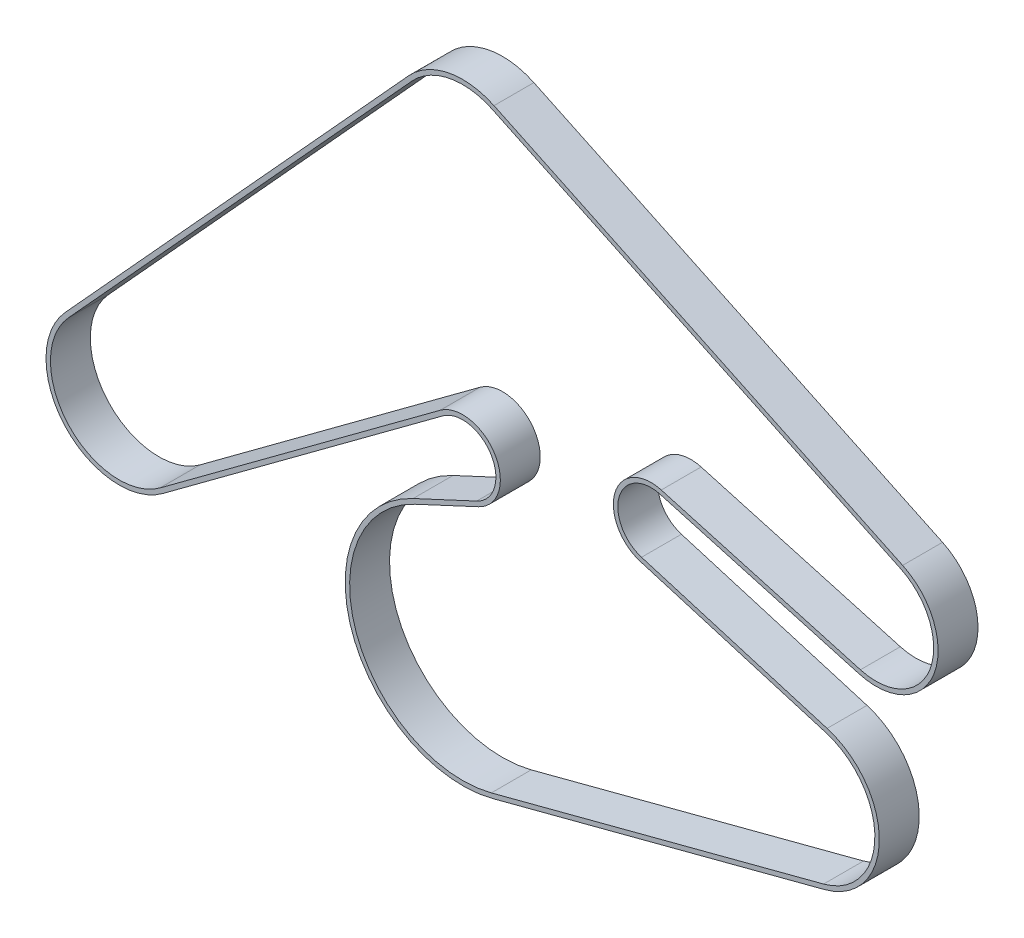
ISO-10303-21;
HEADER;
FILE_DESCRIPTION(('STEP AP214'),'2;1');
FILE_NAME('part.step','',(''),(''),'','','');
FILE_SCHEMA(('AUTOMOTIVE_DESIGN { 1 0 10303 214 1 1 1 1 }'));
ENDSEC;
DATA;
#1=APPLICATION_CONTEXT('core data for automotive mechanical design processes');
#2=APPLICATION_PROTOCOL_DEFINITION('international standard','automotive_design',2000,#1);
#3=PRODUCT_CONTEXT('',#1,'mechanical');
#4=PRODUCT('Part','Part','',(#3));
#5=PRODUCT_RELATED_PRODUCT_CATEGORY('part','',(#4));
#6=PRODUCT_DEFINITION_FORMATION('','',#4);
#7=PRODUCT_DEFINITION_CONTEXT('part definition',#1,'design');
#8=PRODUCT_DEFINITION('design','',#6,#7);
#9=PRODUCT_DEFINITION_SHAPE('','',#8);
#10=(LENGTH_UNIT() NAMED_UNIT(*) SI_UNIT(.MILLI.,.METRE.));
#11=(NAMED_UNIT(*) PLANE_ANGLE_UNIT() SI_UNIT($,.RADIAN.));
#12=(NAMED_UNIT(*) SI_UNIT($,.STERADIAN.) SOLID_ANGLE_UNIT());
#13=UNCERTAINTY_MEASURE_WITH_UNIT(LENGTH_MEASURE(1.E-05),#10,'distance_accuracy_value','');
#14=(GEOMETRIC_REPRESENTATION_CONTEXT(3) GLOBAL_UNCERTAINTY_ASSIGNED_CONTEXT((#13)) GLOBAL_UNIT_ASSIGNED_CONTEXT((#10,
#11,#12)) REPRESENTATION_CONTEXT('',''));
#15=CARTESIAN_POINT('',(0.,0.,0.));
#16=DIRECTION('',(0.,0.,1.));
#17=DIRECTION('',(1.,0.,0.));
#18=AXIS2_PLACEMENT_3D('',#15,#16,#17);
#19=CARTESIAN_POINT('',(85.,91.,18.));
#20=DIRECTION('',(0.,0.,-1.));
#21=DIRECTION('',(-1.,0.,0.));
#22=AXIS2_PLACEMENT_3D('',#19,#20,#21);
#23=PLANE('',#22);
#24=CARTESIAN_POINT('',(85.,91.,18.));
#25=DIRECTION('',(0.,0.,-1.));
#26=DIRECTION('',(1.,0.,0.));
#27=AXIS2_PLACEMENT_3D('',#24,#25,#26);
#28=CIRCLE('',#27,15.);
#29=CARTESIAN_POINT('',(80.707647493196,76.6272580918833,18.));
#30=VERTEX_POINT('',#29);
#31=CARTESIAN_POINT('',(89.0659579003717,105.438420493683,18.));
#32=VERTEX_POINT('',#31);
#33=EDGE_CURVE('E460',#30,#32,#28,.T.);
#34=ORIENTED_EDGE('',*,*,#33,.T.);
#35=DIRECTION('',(0.962561366245532,-0.271063860024781,0.));
#36=VECTOR('',#35,1.);
#37=CARTESIAN_POINT('',(89.0659579003717,105.438420493683,18.));
#38=LINE('',#37,#36);
#39=CARTESIAN_POINT('',(178.940955528026,80.1290068490307,18.));
#40=VERTEX_POINT('',#39);
#41=EDGE_CURVE('E464',#32,#40,#38,.T.);
#42=ORIENTED_EDGE('',*,*,#41,.T.);
#43=CARTESIAN_POINT('',(186.530743608719,107.080725103906,18.));
#44=DIRECTION('',(0.,0.,1.));
#45=DIRECTION('',(1.,0.,0.));
#46=AXIS2_PLACEMENT_3D('',#43,#44,#45);
#47=CIRCLE('',#46,28.);
#48=CARTESIAN_POINT('',(198.527826902004,132.380329694768,18.));
#49=VERTEX_POINT('',#48);
#50=EDGE_CURVE('E468',#40,#49,#47,.T.);
#51=ORIENTED_EDGE('',*,*,#50,.T.);
#52=DIRECTION('',(-0.903557306816511,0.428467260474466,0.));
#53=VECTOR('',#52,1.);
#54=CARTESIAN_POINT('',(14.1394195956574,219.817391124945,18.));
#55=LINE('',#54,#53);
#56=CARTESIAN_POINT('',(14.1394195956574,219.817391124945,18.));
#57=VERTEX_POINT('',#56);
#58=EDGE_CURVE('E471',#49,#57,#55,.T.);
#59=ORIENTED_EDGE('',*,*,#58,.T.);
#60=CARTESIAN_POINT('',(0.,190.,18.));
#61=DIRECTION('',(0.,0.,1.));
#62=DIRECTION('',(-1.,0.,0.));
#63=AXIS2_PLACEMENT_3D('',#60,#61,#62);
#64=CIRCLE('',#63,33.);
#65=CARTESIAN_POINT('',(-24.3855428491398,212.233877303628,18.));
#66=VERTEX_POINT('',#65);
#67=EDGE_CURVE('E474',#57,#66,#64,.T.);
#68=ORIENTED_EDGE('',*,*,#67,.T.);
#69=DIRECTION('',(-0.673753857685684,-0.738955843913328,0.));
#70=VECTOR('',#69,1.);
#71=CARTESIAN_POINT('',(-24.3855428491398,212.233877303628,18.));
#72=LINE('',#71,#70);
#73=CARTESIAN_POINT('',(-179.38554284914,42.2338773036282,18.));
#74=VERTEX_POINT('',#73);
#75=EDGE_CURVE('E477',#66,#74,#72,.T.);
#76=ORIENTED_EDGE('',*,*,#75,.T.);
#77=CARTESIAN_POINT('',(-155.,20.0000000000006,18.));
#78=DIRECTION('',(0.,0.,1.));
#79=DIRECTION('',(1.,0.,0.));
#80=AXIS2_PLACEMENT_3D('',#77,#78,#79);
#81=CIRCLE('',#80,33.);
#82=CARTESIAN_POINT('',(-135.368386906199,-6.5254550825292,18.));
#83=VERTEX_POINT('',#82);
#84=EDGE_CURVE('E480',#74,#83,#81,.T.);
#85=ORIENTED_EDGE('',*,*,#84,.T.);
#86=DIRECTION('',(0.803801669167571,0.594897366478813,0.));
#87=VECTOR('',#86,1.);
#88=CARTESIAN_POINT('',(-135.368386906199,-6.52545508252921,18.));
#89=LINE('',#88,#87);
#90=CARTESIAN_POINT('',(-8.9234604971822,87.0570250375136,18.));
#91=VERTEX_POINT('',#90);
#92=EDGE_CURVE('E483',#83,#91,#89,.T.);
#93=ORIENTED_EDGE('',*,*,#92,.T.);
#94=CARTESIAN_POINT('',(0.,75.,18.));
#95=DIRECTION('',(0.,0.,-1.));
#96=DIRECTION('',(-1.,0.,0.));
#97=AXIS2_PLACEMENT_3D('',#94,#95,#96);
#98=CIRCLE('',#97,15.);
#99=CARTESIAN_POINT('',(6.32771680782256,61.4,18.));
#100=VERTEX_POINT('',#99);
#101=EDGE_CURVE('E486',#91,#100,#98,.T.);
#102=ORIENTED_EDGE('',*,*,#101,.T.);
#103=DIRECTION('',(-0.906666666666666,-0.421847787188171,0.));
#104=VECTOR('',#103,1.);
#105=CARTESIAN_POINT('',(6.32771680782256,61.4,18.));
#106=LINE('',#105,#104);
#107=CARTESIAN_POINT('',(-22.3579327209731,48.0533333333333,18.));
#108=VERTEX_POINT('',#107);
#109=EDGE_CURVE('E489',#100,#108,#106,.T.);
#110=ORIENTED_EDGE('',*,*,#109,.T.);
#111=CARTESIAN_POINT('',(0.,0.,18.));
#112=DIRECTION('',(0.,0.,1.));
#113=DIRECTION('',(1.,0.,0.));
#114=AXIS2_PLACEMENT_3D('',#111,#112,#113);
#115=CIRCLE('',#114,53.);
#116=CARTESIAN_POINT('',(13.4534288638692,-51.2640736949846,18.));
#117=VERTEX_POINT('',#116);
#118=EDGE_CURVE('E492',#108,#117,#115,.T.);
#119=ORIENTED_EDGE('',*,*,#118,.T.);
#120=DIRECTION('',(0.967246673490275,0.253838280450362,0.));
#121=VECTOR('',#120,1.);
#122=CARTESIAN_POINT('',(13.4534288638692,-51.2640736949846,18.));
#123=LINE('',#122,#121);
#124=CARTESIAN_POINT('',(163.376663254862,-11.9191402251785,18.));
#125=VERTEX_POINT('',#124);
#126=EDGE_CURVE('E495',#117,#125,#123,.T.);
#127=ORIENTED_EDGE('',*,*,#126,.T.);
#128=CARTESIAN_POINT('',(155.,20.0000000000005,18.));
#129=DIRECTION('',(0.,0.,1.));
#130=DIRECTION('',(-1.,0.,0.));
#131=AXIS2_PLACEMENT_3D('',#128,#129,#130);
#132=CIRCLE('',#131,33.);
#133=CARTESIAN_POINT('',(164.443175514969,51.6200321978572,18.));
#134=VERTEX_POINT('',#133);
#135=EDGE_CURVE('E498',#125,#134,#132,.T.);
#136=ORIENTED_EDGE('',*,*,#135,.T.);
#137=DIRECTION('',(-0.958182793874446,0.286156833786931,0.));
#138=VECTOR('',#137,1.);
#139=CARTESIAN_POINT('',(164.443175514969,51.6200321978572,18.));
#140=LINE('',#139,#138);
#141=EDGE_CURVE('E501',#134,#30,#140,.T.);
#142=ORIENTED_EDGE('',*,*,#141,.T.);
#143=EDGE_LOOP('',(#34,#42,#51,#59,#68,#76,#85,#93,#102,#110,#119,#127,#136,#142));
#144=FACE_BOUND('',#143,.T.);
#145=CARTESIAN_POINT('',(85.,91.,18.));
#146=DIRECTION('',(0.,0.,1.));
#147=DIRECTION('',(1.,0.,0.));
#148=AXIS2_PLACEMENT_3D('',#145,#146,#147);
#149=CIRCLE('',#148,17.);
#150=CARTESIAN_POINT('',(80.1353338256222,74.7108925041344,18.));
#151=VERTEX_POINT('',#150);
#152=CARTESIAN_POINT('',(89.6080856204213,107.363543226174,18.));
#153=VERTEX_POINT('',#152);
#154=EDGE_CURVE('E311',#151,#153,#149,.F.);
#155=ORIENTED_EDGE('',*,*,#154,.F.);
#156=DIRECTION('',(-0.958182793874446,0.286156833786931,0.));
#157=VECTOR('',#156,1.);
#158=CARTESIAN_POINT('',(163.870861847395,49.7036666101083,18.));
#159=LINE('',#158,#157);
#160=CARTESIAN_POINT('',(163.870861847395,49.7036666101084,18.));
#161=VERTEX_POINT('',#160);
#162=EDGE_CURVE('E370',#161,#151,#159,.T.);
#163=ORIENTED_EDGE('',*,*,#162,.F.);
#164=CARTESIAN_POINT('',(155.,20.0000000000005,18.));
#165=DIRECTION('',(0.,0.,1.));
#166=DIRECTION('',(1.,0.,0.));
#167=AXIS2_PLACEMENT_3D('',#164,#165,#166);
#168=CIRCLE('',#167,31.);
#169=CARTESIAN_POINT('',(162.868986693961,-9.98464687819798,18.));
#170=VERTEX_POINT('',#169);
#171=EDGE_CURVE('E367',#170,#161,#168,.T.);
#172=ORIENTED_EDGE('',*,*,#171,.F.);
#173=DIRECTION('',(0.967246673490275,0.253838280450362,0.));
#174=VECTOR('',#173,1.);
#175=CARTESIAN_POINT('',(12.9457523029684,-49.3295803480041,18.));
#176=LINE('',#175,#174);
#177=CARTESIAN_POINT('',(12.9457523029685,-49.3295803480041,18.));
#178=VERTEX_POINT('',#177);
#179=EDGE_CURVE('E364',#178,#170,#176,.T.);
#180=ORIENTED_EDGE('',*,*,#179,.F.);
#181=CARTESIAN_POINT('',(0.,0.,18.));
#182=DIRECTION('',(0.,0.,1.));
#183=DIRECTION('',(1.,0.,0.));
#184=AXIS2_PLACEMENT_3D('',#181,#182,#183);
#185=CIRCLE('',#184,51.);
#186=CARTESIAN_POINT('',(-21.5142371465967,46.24,18.));
#187=VERTEX_POINT('',#186);
#188=EDGE_CURVE('E361',#187,#178,#185,.T.);
#189=ORIENTED_EDGE('',*,*,#188,.F.);
#190=DIRECTION('',(-0.906666666666666,-0.421847787188171,0.));
#191=VECTOR('',#190,1.);
#192=CARTESIAN_POINT('',(7.1714123821989,59.5866666666667,18.));
#193=LINE('',#192,#191);
#194=CARTESIAN_POINT('',(7.17141238219892,59.5866666666667,18.));
#195=VERTEX_POINT('',#194);
#196=EDGE_CURVE('E358',#195,#187,#193,.T.);
#197=ORIENTED_EDGE('',*,*,#196,.F.);
#198=CARTESIAN_POINT('',(0.,75.,18.));
#199=DIRECTION('',(0.,0.,1.));
#200=DIRECTION('',(1.,0.,0.));
#201=AXIS2_PLACEMENT_3D('',#198,#199,#200);
#202=CIRCLE('',#201,17.);
#203=CARTESIAN_POINT('',(-10.1132552301398,88.6646283758488,18.));
#204=VERTEX_POINT('',#203);
#205=EDGE_CURVE('E355',#204,#195,#202,.F.);
#206=ORIENTED_EDGE('',*,*,#205,.F.);
#207=DIRECTION('',(0.803801669167571,0.594897366478813,0.));
#208=VECTOR('',#207,1.);
#209=CARTESIAN_POINT('',(-136.558181639157,-4.91785174419407,18.));
#210=LINE('',#209,#208);
#211=CARTESIAN_POINT('',(-136.558181639157,-4.91785174419405,18.));
#212=VERTEX_POINT('',#211);
#213=EDGE_CURVE('E352',#212,#204,#210,.T.);
#214=ORIENTED_EDGE('',*,*,#213,.F.);
#215=CARTESIAN_POINT('',(-155.,20.0000000000006,18.));
#216=DIRECTION('',(0.,0.,1.));
#217=DIRECTION('',(1.,0.,0.));
#218=AXIS2_PLACEMENT_3D('',#215,#216,#217);
#219=CIRCLE('',#218,31.);
#220=CARTESIAN_POINT('',(-177.907631161313,40.8863695882568,18.));
#221=VERTEX_POINT('',#220);
#222=EDGE_CURVE('E349',#221,#212,#219,.T.);
#223=ORIENTED_EDGE('',*,*,#222,.F.);
#224=DIRECTION('',(-0.673753857685684,-0.738955843913328,0.));
#225=VECTOR('',#224,1.);
#226=CARTESIAN_POINT('',(-22.9076311613132,210.886369588256,18.));
#227=LINE('',#226,#225);
#228=CARTESIAN_POINT('',(-22.9076311613132,210.886369588256,18.));
#229=VERTEX_POINT('',#228);
#230=EDGE_CURVE('E346',#229,#221,#227,.T.);
#231=ORIENTED_EDGE('',*,*,#230,.F.);
#232=CARTESIAN_POINT('',(0.,190.,18.));
#233=DIRECTION('',(0.,0.,1.));
#234=DIRECTION('',(1.,0.,0.));
#235=AXIS2_PLACEMENT_3D('',#232,#233,#234);
#236=CIRCLE('',#235,31.);
#237=CARTESIAN_POINT('',(13.2824850747085,218.010276511312,18.));
#238=VERTEX_POINT('',#237);
#239=EDGE_CURVE('E343',#238,#229,#236,.T.);
#240=ORIENTED_EDGE('',*,*,#239,.F.);
#241=DIRECTION('',(-0.903557306816511,0.428467260474466,0.));
#242=VECTOR('',#241,1.);
#243=CARTESIAN_POINT('',(13.2824850747085,218.010276511312,18.));
#244=LINE('',#243,#242);
#245=CARTESIAN_POINT('',(197.670892381056,130.573215081135,18.));
#246=VERTEX_POINT('',#245);
#247=EDGE_CURVE('E338',#246,#238,#244,.T.);
#248=ORIENTED_EDGE('',*,*,#247,.F.);
#249=CARTESIAN_POINT('',(186.530743608719,107.080725103906,18.));
#250=DIRECTION('',(0.,0.,1.));
#251=DIRECTION('',(1.,0.,0.));
#252=AXIS2_PLACEMENT_3D('',#249,#250,#251);
#253=CIRCLE('',#252,26.);
#254=CARTESIAN_POINT('',(179.483083248075,82.0541295815217,18.));
#255=VERTEX_POINT('',#254);
#256=EDGE_CURVE('E334',#255,#246,#253,.T.);
#257=ORIENTED_EDGE('',*,*,#256,.F.);
#258=DIRECTION('',(0.962561366245532,-0.271063860024781,0.));
#259=VECTOR('',#258,1.);
#260=CARTESIAN_POINT('',(89.6080856204213,107.363543226174,18.));
#261=LINE('',#260,#259);
#262=EDGE_CURVE('E320',#153,#255,#261,.T.);
#263=ORIENTED_EDGE('',*,*,#262,.F.);
#264=EDGE_LOOP('',(#155,#163,#172,#180,#189,#197,#206,#214,#223,#231,#240,#248,#257,#263));
#265=FACE_BOUND('',#264,.T.);
#266=ADVANCED_FACE('F125',(#144,#265),#23,.F.);
#267=CARTESIAN_POINT('',(85.,91.,0.));
#268=DIRECTION('',(0.,0.,-1.));
#269=DIRECTION('',(-1.,0.,0.));
#270=AXIS2_PLACEMENT_3D('',#267,#268,#269);
#271=PLANE('',#270);
#272=CARTESIAN_POINT('',(85.,91.,0.));
#273=DIRECTION('',(0.,0.,-1.));
#274=DIRECTION('',(1.,0.,0.));
#275=AXIS2_PLACEMENT_3D('',#272,#273,#274);
#276=CIRCLE('',#275,15.);
#277=CARTESIAN_POINT('',(80.707647493196,76.6272580918833,0.));
#278=VERTEX_POINT('',#277);
#279=CARTESIAN_POINT('',(89.0659579003717,105.438420493683,0.));
#280=VERTEX_POINT('',#279);
#281=EDGE_CURVE('E329',#278,#280,#276,.T.);
#282=ORIENTED_EDGE('',*,*,#281,.F.);
#283=DIRECTION('',(-0.958182793874446,0.286156833786931,0.));
#284=VECTOR('',#283,1.);
#285=CARTESIAN_POINT('',(164.443175514969,51.6200321978572,0.));
#286=LINE('',#285,#284);
#287=CARTESIAN_POINT('',(164.443175514969,51.6200321978572,0.));
#288=VERTEX_POINT('',#287);
#289=EDGE_CURVE('E465',#288,#278,#286,.T.);
#290=ORIENTED_EDGE('',*,*,#289,.F.);
#291=CARTESIAN_POINT('',(155.,20.0000000000005,0.));
#292=DIRECTION('',(0.,0.,1.));
#293=DIRECTION('',(-1.,0.,0.));
#294=AXIS2_PLACEMENT_3D('',#291,#292,#293);
#295=CIRCLE('',#294,33.);
#296=CARTESIAN_POINT('',(163.376663254862,-11.9191402251785,0.));
#297=VERTEX_POINT('',#296);
#298=EDGE_CURVE('E541',#297,#288,#295,.T.);
#299=ORIENTED_EDGE('',*,*,#298,.F.);
#300=DIRECTION('',(0.967246673490275,0.253838280450362,0.));
#301=VECTOR('',#300,1.);
#302=CARTESIAN_POINT('',(13.4534288638692,-51.2640736949846,0.));
#303=LINE('',#302,#301);
#304=CARTESIAN_POINT('',(13.4534288638692,-51.2640736949846,0.));
#305=VERTEX_POINT('',#304);
#306=EDGE_CURVE('E538',#305,#297,#303,.T.);
#307=ORIENTED_EDGE('',*,*,#306,.F.);
#308=CARTESIAN_POINT('',(0.,0.,0.));
#309=DIRECTION('',(0.,0.,1.));
#310=DIRECTION('',(1.,0.,0.));
#311=AXIS2_PLACEMENT_3D('',#308,#309,#310);
#312=CIRCLE('',#311,53.);
#313=CARTESIAN_POINT('',(-22.3579327209731,48.0533333333333,0.));
#314=VERTEX_POINT('',#313);
#315=EDGE_CURVE('E535',#314,#305,#312,.T.);
#316=ORIENTED_EDGE('',*,*,#315,.F.);
#317=DIRECTION('',(-0.906666666666666,-0.421847787188171,0.));
#318=VECTOR('',#317,1.);
#319=CARTESIAN_POINT('',(6.32771680782256,61.4,0.));
#320=LINE('',#319,#318);
#321=CARTESIAN_POINT('',(6.32771680782256,61.4,0.));
#322=VERTEX_POINT('',#321);
#323=EDGE_CURVE('E532',#322,#314,#320,.T.);
#324=ORIENTED_EDGE('',*,*,#323,.F.);
#325=CARTESIAN_POINT('',(0.,75.,0.));
#326=DIRECTION('',(0.,0.,-1.));
#327=DIRECTION('',(-1.,0.,0.));
#328=AXIS2_PLACEMENT_3D('',#325,#326,#327);
#329=CIRCLE('',#328,15.);
#330=CARTESIAN_POINT('',(-8.9234604971822,87.0570250375136,0.));
#331=VERTEX_POINT('',#330);
#332=EDGE_CURVE('E529',#331,#322,#329,.T.);
#333=ORIENTED_EDGE('',*,*,#332,.F.);
#334=DIRECTION('',(0.803801669167571,0.594897366478813,0.));
#335=VECTOR('',#334,1.);
#336=CARTESIAN_POINT('',(-135.368386906199,-6.52545508252921,0.));
#337=LINE('',#336,#335);
#338=CARTESIAN_POINT('',(-135.368386906199,-6.5254550825292,0.));
#339=VERTEX_POINT('',#338);
#340=EDGE_CURVE('E526',#339,#331,#337,.T.);
#341=ORIENTED_EDGE('',*,*,#340,.F.);
#342=CARTESIAN_POINT('',(-155.,20.0000000000006,0.));
#343=DIRECTION('',(0.,0.,1.));
#344=DIRECTION('',(1.,0.,0.));
#345=AXIS2_PLACEMENT_3D('',#342,#343,#344);
#346=CIRCLE('',#345,33.);
#347=CARTESIAN_POINT('',(-179.38554284914,42.2338773036282,0.));
#348=VERTEX_POINT('',#347);
#349=EDGE_CURVE('E523',#348,#339,#346,.T.);
#350=ORIENTED_EDGE('',*,*,#349,.F.);
#351=DIRECTION('',(-0.673753857685684,-0.738955843913328,0.));
#352=VECTOR('',#351,1.);
#353=CARTESIAN_POINT('',(-24.3855428491398,212.233877303628,0.));
#354=LINE('',#353,#352);
#355=CARTESIAN_POINT('',(-24.3855428491398,212.233877303628,0.));
#356=VERTEX_POINT('',#355);
#357=EDGE_CURVE('E520',#356,#348,#354,.T.);
#358=ORIENTED_EDGE('',*,*,#357,.F.);
#359=CARTESIAN_POINT('',(0.,190.,0.));
#360=DIRECTION('',(0.,0.,1.));
#361=DIRECTION('',(-1.,0.,0.));
#362=AXIS2_PLACEMENT_3D('',#359,#360,#361);
#363=CIRCLE('',#362,33.);
#364=CARTESIAN_POINT('',(14.1394195956574,219.817391124945,0.));
#365=VERTEX_POINT('',#364);
#366=EDGE_CURVE('E517',#365,#356,#363,.T.);
#367=ORIENTED_EDGE('',*,*,#366,.F.);
#368=DIRECTION('',(-0.903557306816511,0.428467260474466,0.));
#369=VECTOR('',#368,1.);
#370=CARTESIAN_POINT('',(14.1394195956574,219.817391124945,0.));
#371=LINE('',#370,#369);
#372=CARTESIAN_POINT('',(198.527826902004,132.380329694768,0.));
#373=VERTEX_POINT('',#372);
#374=EDGE_CURVE('E514',#373,#365,#371,.T.);
#375=ORIENTED_EDGE('',*,*,#374,.F.);
#376=CARTESIAN_POINT('',(186.530743608719,107.080725103906,0.));
#377=DIRECTION('',(0.,0.,1.));
#378=DIRECTION('',(1.,0.,0.));
#379=AXIS2_PLACEMENT_3D('',#376,#377,#378);
#380=CIRCLE('',#379,28.);
#381=CARTESIAN_POINT('',(178.940955528026,80.1290068490307,0.));
#382=VERTEX_POINT('',#381);
#383=EDGE_CURVE('E511',#382,#373,#380,.T.);
#384=ORIENTED_EDGE('',*,*,#383,.F.);
#385=DIRECTION('',(0.962561366245532,-0.271063860024781,0.));
#386=VECTOR('',#385,1.);
#387=CARTESIAN_POINT('',(89.0659579003717,105.438420493683,0.));
#388=LINE('',#387,#386);
#389=EDGE_CURVE('E508',#280,#382,#388,.T.);
#390=ORIENTED_EDGE('',*,*,#389,.F.);
#391=EDGE_LOOP('',(#282,#290,#299,#307,#316,#324,#333,#341,#350,#358,#367,#375,#384,#390));
#392=FACE_BOUND('',#391,.T.);
#393=DIRECTION('',(-0.958182793874446,0.286156833786931,0.));
#394=VECTOR('',#393,1.);
#395=CARTESIAN_POINT('',(163.870861847395,49.7036666101083,0.));
#396=LINE('',#395,#394);
#397=CARTESIAN_POINT('',(163.870861847395,49.7036666101083,0.));
#398=VERTEX_POINT('',#397);
#399=CARTESIAN_POINT('',(80.1353338256222,74.7108925041345,0.));
#400=VERTEX_POINT('',#399);
#401=EDGE_CURVE('E321',#398,#400,#396,.T.);
#402=ORIENTED_EDGE('',*,*,#401,.T.);
#403=CARTESIAN_POINT('',(85.,91.,0.));
#404=DIRECTION('',(0.,0.,1.));
#405=DIRECTION('',(1.,0.,0.));
#406=AXIS2_PLACEMENT_3D('',#403,#404,#405);
#407=CIRCLE('',#406,17.);
#408=CARTESIAN_POINT('',(89.6080856204213,107.363543226174,0.));
#409=VERTEX_POINT('',#408);
#410=EDGE_CURVE('E149',#400,#409,#407,.F.);
#411=ORIENTED_EDGE('',*,*,#410,.T.);
#412=DIRECTION('',(0.962561366245532,-0.271063860024781,0.));
#413=VECTOR('',#412,1.);
#414=CARTESIAN_POINT('',(89.6080856204213,107.363543226174,0.));
#415=LINE('',#414,#413);
#416=CARTESIAN_POINT('',(179.483083248075,82.0541295815217,0.));
#417=VERTEX_POINT('',#416);
#418=EDGE_CURVE('E327',#409,#417,#415,.T.);
#419=ORIENTED_EDGE('',*,*,#418,.T.);
#420=CARTESIAN_POINT('',(186.530743608719,107.080725103906,0.));
#421=DIRECTION('',(0.,0.,1.));
#422=DIRECTION('',(1.,0.,0.));
#423=AXIS2_PLACEMENT_3D('',#420,#421,#422);
#424=CIRCLE('',#423,26.);
#425=CARTESIAN_POINT('',(197.670892381056,130.573215081135,0.));
#426=VERTEX_POINT('',#425);
#427=EDGE_CURVE('E377',#417,#426,#424,.T.);
#428=ORIENTED_EDGE('',*,*,#427,.T.);
#429=DIRECTION('',(-0.903557306816511,0.428467260474466,0.));
#430=VECTOR('',#429,1.);
#431=CARTESIAN_POINT('',(13.2824850747085,218.010276511312,0.));
#432=LINE('',#431,#430);
#433=CARTESIAN_POINT('',(13.2824850747085,218.010276511312,0.));
#434=VERTEX_POINT('',#433);
#435=EDGE_CURVE('E381',#426,#434,#432,.T.);
#436=ORIENTED_EDGE('',*,*,#435,.T.);
#437=CARTESIAN_POINT('',(0.,190.,0.));
#438=DIRECTION('',(0.,0.,1.));
#439=DIRECTION('',(1.,0.,0.));
#440=AXIS2_PLACEMENT_3D('',#437,#438,#439);
#441=CIRCLE('',#440,31.);
#442=CARTESIAN_POINT('',(-22.9076311613132,210.886369588256,0.));
#443=VERTEX_POINT('',#442);
#444=EDGE_CURVE('E385',#434,#443,#441,.T.);
#445=ORIENTED_EDGE('',*,*,#444,.T.);
#446=DIRECTION('',(-0.673753857685684,-0.738955843913328,0.));
#447=VECTOR('',#446,1.);
#448=CARTESIAN_POINT('',(-22.9076311613132,210.886369588256,0.));
#449=LINE('',#448,#447);
#450=CARTESIAN_POINT('',(-177.907631161313,40.8863695882568,0.));
#451=VERTEX_POINT('',#450);
#452=EDGE_CURVE('E389',#443,#451,#449,.T.);
#453=ORIENTED_EDGE('',*,*,#452,.T.);
#454=CARTESIAN_POINT('',(-155.,20.0000000000006,0.));
#455=DIRECTION('',(0.,0.,1.));
#456=DIRECTION('',(1.,0.,0.));
#457=AXIS2_PLACEMENT_3D('',#454,#455,#456);
#458=CIRCLE('',#457,31.);
#459=CARTESIAN_POINT('',(-136.558181639157,-4.91785174419405,0.));
#460=VERTEX_POINT('',#459);
#461=EDGE_CURVE('E393',#451,#460,#458,.T.);
#462=ORIENTED_EDGE('',*,*,#461,.T.);
#463=DIRECTION('',(0.803801669167571,0.594897366478813,0.));
#464=VECTOR('',#463,1.);
#465=CARTESIAN_POINT('',(-136.558181639157,-4.91785174419407,0.));
#466=LINE('',#465,#464);
#467=CARTESIAN_POINT('',(-10.1132552301398,88.6646283758488,0.));
#468=VERTEX_POINT('',#467);
#469=EDGE_CURVE('E397',#460,#468,#466,.T.);
#470=ORIENTED_EDGE('',*,*,#469,.T.);
#471=CARTESIAN_POINT('',(0.,75.,0.));
#472=DIRECTION('',(0.,0.,1.));
#473=DIRECTION('',(1.,0.,0.));
#474=AXIS2_PLACEMENT_3D('',#471,#472,#473);
#475=CIRCLE('',#474,17.);
#476=CARTESIAN_POINT('',(7.17141238219892,59.5866666666667,0.));
#477=VERTEX_POINT('',#476);
#478=EDGE_CURVE('E401',#468,#477,#475,.F.);
#479=ORIENTED_EDGE('',*,*,#478,.T.);
#480=DIRECTION('',(-0.906666666666666,-0.421847787188171,0.));
#481=VECTOR('',#480,1.);
#482=CARTESIAN_POINT('',(7.1714123821989,59.5866666666667,0.));
#483=LINE('',#482,#481);
#484=CARTESIAN_POINT('',(-21.5142371465967,46.24,0.));
#485=VERTEX_POINT('',#484);
#486=EDGE_CURVE('E405',#477,#485,#483,.T.);
#487=ORIENTED_EDGE('',*,*,#486,.T.);
#488=CARTESIAN_POINT('',(0.,0.,0.));
#489=DIRECTION('',(0.,0.,1.));
#490=DIRECTION('',(1.,0.,0.));
#491=AXIS2_PLACEMENT_3D('',#488,#489,#490);
#492=CIRCLE('',#491,51.);
#493=CARTESIAN_POINT('',(12.9457523029685,-49.3295803480041,0.));
#494=VERTEX_POINT('',#493);
#495=EDGE_CURVE('E409',#485,#494,#492,.T.);
#496=ORIENTED_EDGE('',*,*,#495,.T.);
#497=DIRECTION('',(0.967246673490275,0.253838280450362,0.));
#498=VECTOR('',#497,1.);
#499=CARTESIAN_POINT('',(12.9457523029684,-49.3295803480041,0.));
#500=LINE('',#499,#498);
#501=CARTESIAN_POINT('',(162.868986693961,-9.98464687819798,0.));
#502=VERTEX_POINT('',#501);
#503=EDGE_CURVE('E413',#494,#502,#500,.T.);
#504=ORIENTED_EDGE('',*,*,#503,.T.);
#505=CARTESIAN_POINT('',(155.,20.0000000000005,0.));
#506=DIRECTION('',(0.,0.,1.));
#507=DIRECTION('',(1.,0.,0.));
#508=AXIS2_PLACEMENT_3D('',#505,#506,#507);
#509=CIRCLE('',#508,31.);
#510=EDGE_CURVE('E417',#502,#398,#509,.T.);
#511=ORIENTED_EDGE('',*,*,#510,.T.);
#512=EDGE_LOOP('',(#402,#411,#419,#428,#436,#445,#453,#462,#470,#479,#487,#496,#504,#511));
#513=FACE_BOUND('',#512,.T.);
#514=ADVANCED_FACE('F604',(#392,#513),#271,.T.);
#515=CARTESIAN_POINT('',(85.,91.,18.));
#516=DIRECTION('',(0.,0.,-1.));
#517=DIRECTION('',(-1.,0.,0.));
#518=AXIS2_PLACEMENT_3D('',#515,#516,#517);
#519=CYLINDRICAL_SURFACE('',#518,15.);
#520=ORIENTED_EDGE('',*,*,#281,.T.);
#521=DIRECTION('',(0.,0.,-1.));
#522=VECTOR('',#521,1.);
#523=CARTESIAN_POINT('',(89.0659579003717,105.438420493683,18.));
#524=LINE('',#523,#522);
#525=EDGE_CURVE('E12',#32,#280,#524,.T.);
#526=ORIENTED_EDGE('',*,*,#525,.F.);
#527=ORIENTED_EDGE('',*,*,#33,.F.);
#528=DIRECTION('',(0.,0.,-1.));
#529=VECTOR('',#528,1.);
#530=CARTESIAN_POINT('',(80.707647493196,76.6272580918833,18.));
#531=LINE('',#530,#529);
#532=EDGE_CURVE('E504',#30,#278,#531,.T.);
#533=ORIENTED_EDGE('',*,*,#532,.T.);
#534=EDGE_LOOP('',(#520,#526,#527,#533));
#535=FACE_BOUND('',#534,.T.);
#536=ADVANCED_FACE('F127',(#535),#519,.F.);
#537=CARTESIAN_POINT('',(89.0659579003717,105.438420493683,18.));
#538=DIRECTION('',(0.271063860024781,0.962561366245532,0.));
#539=DIRECTION('',(-0.962561366245532,0.271063860024781,0.));
#540=AXIS2_PLACEMENT_3D('',#537,#538,#539);
#541=PLANE('',#540);
#542=ORIENTED_EDGE('',*,*,#389,.T.);
#543=DIRECTION('',(0.,0.,-1.));
#544=VECTOR('',#543,1.);
#545=CARTESIAN_POINT('',(178.940955528026,80.1290068490307,18.));
#546=LINE('',#545,#544);
#547=EDGE_CURVE('E134',#40,#382,#546,.T.);
#548=ORIENTED_EDGE('',*,*,#547,.F.);
#549=ORIENTED_EDGE('',*,*,#41,.F.);
#550=ORIENTED_EDGE('',*,*,#525,.T.);
#551=EDGE_LOOP('',(#542,#548,#549,#550));
#552=FACE_BOUND('',#551,.T.);
#553=ADVANCED_FACE('F621',(#552),#541,.F.);
#554=CARTESIAN_POINT('',(186.530743608719,107.080725103906,18.));
#555=DIRECTION('',(0.,0.,-1.));
#556=DIRECTION('',(-1.,0.,0.));
#557=AXIS2_PLACEMENT_3D('',#554,#555,#556);
#558=CYLINDRICAL_SURFACE('',#557,28.);
#559=ORIENTED_EDGE('',*,*,#383,.T.);
#560=DIRECTION('',(0.,0.,-1.));
#561=VECTOR('',#560,1.);
#562=CARTESIAN_POINT('',(198.527826902004,132.380329694768,18.));
#563=LINE('',#562,#561);
#564=EDGE_CURVE('E589',#49,#373,#563,.T.);
#565=ORIENTED_EDGE('',*,*,#564,.F.);
#566=ORIENTED_EDGE('',*,*,#50,.F.);
#567=ORIENTED_EDGE('',*,*,#547,.T.);
#568=EDGE_LOOP('',(#559,#565,#566,#567));
#569=FACE_BOUND('',#568,.T.);
#570=ADVANCED_FACE('F598',(#569),#558,.T.);
#571=CARTESIAN_POINT('',(14.1394195956574,219.817391124945,18.));
#572=DIRECTION('',(-0.428467260474466,-0.903557306816511,0.));
#573=DIRECTION('',(0.903557306816511,-0.428467260474466,0.));
#574=AXIS2_PLACEMENT_3D('',#571,#572,#573);
#575=PLANE('',#574);
#576=ORIENTED_EDGE('',*,*,#374,.T.);
#577=DIRECTION('',(0.,0.,-1.));
#578=VECTOR('',#577,1.);
#579=CARTESIAN_POINT('',(14.1394195956574,219.817391124945,18.));
#580=LINE('',#579,#578);
#581=EDGE_CURVE('E585',#57,#365,#580,.T.);
#582=ORIENTED_EDGE('',*,*,#581,.F.);
#583=ORIENTED_EDGE('',*,*,#58,.F.);
#584=ORIENTED_EDGE('',*,*,#564,.T.);
#585=EDGE_LOOP('',(#576,#582,#583,#584));
#586=FACE_BOUND('',#585,.T.);
#587=ADVANCED_FACE('F610',(#586),#575,.F.);
#588=CARTESIAN_POINT('',(0.,190.,18.));
#589=DIRECTION('',(0.,0.,-1.));
#590=DIRECTION('',(-1.,0.,0.));
#591=AXIS2_PLACEMENT_3D('',#588,#589,#590);
#592=CYLINDRICAL_SURFACE('',#591,33.);
#593=ORIENTED_EDGE('',*,*,#366,.T.);
#594=DIRECTION('',(0.,0.,-1.));
#595=VECTOR('',#594,1.);
#596=CARTESIAN_POINT('',(-24.3855428491398,212.233877303628,18.));
#597=LINE('',#596,#595);
#598=EDGE_CURVE('E581',#66,#356,#597,.T.);
#599=ORIENTED_EDGE('',*,*,#598,.F.);
#600=ORIENTED_EDGE('',*,*,#67,.F.);
#601=ORIENTED_EDGE('',*,*,#581,.T.);
#602=EDGE_LOOP('',(#593,#599,#600,#601));
#603=FACE_BOUND('',#602,.T.);
#604=ADVANCED_FACE('F614',(#603),#592,.T.);
#605=CARTESIAN_POINT('',(-24.3855428491398,212.233877303628,18.));
#606=DIRECTION('',(0.738955843913328,-0.673753857685684,0.));
#607=DIRECTION('',(0.673753857685684,0.738955843913328,0.));
#608=AXIS2_PLACEMENT_3D('',#605,#606,#607);
#609=PLANE('',#608);
#610=ORIENTED_EDGE('',*,*,#357,.T.);
#611=DIRECTION('',(0.,0.,-1.));
#612=VECTOR('',#611,1.);
#613=CARTESIAN_POINT('',(-179.38554284914,42.2338773036282,18.));
#614=LINE('',#613,#612);
#615=EDGE_CURVE('E577',#74,#348,#614,.T.);
#616=ORIENTED_EDGE('',*,*,#615,.F.);
#617=ORIENTED_EDGE('',*,*,#75,.F.);
#618=ORIENTED_EDGE('',*,*,#598,.T.);
#619=EDGE_LOOP('',(#610,#616,#617,#618));
#620=FACE_BOUND('',#619,.T.);
#621=ADVANCED_FACE('F664',(#620),#609,.F.);
#622=CARTESIAN_POINT('',(-155.,20.0000000000006,18.));
#623=DIRECTION('',(0.,0.,-1.));
#624=DIRECTION('',(-1.,0.,0.));
#625=AXIS2_PLACEMENT_3D('',#622,#623,#624);
#626=CYLINDRICAL_SURFACE('',#625,33.);
#627=ORIENTED_EDGE('',*,*,#349,.T.);
#628=DIRECTION('',(0.,0.,-1.));
#629=VECTOR('',#628,1.);
#630=CARTESIAN_POINT('',(-135.368386906199,-6.5254550825292,18.));
#631=LINE('',#630,#629);
#632=EDGE_CURVE('E573',#83,#339,#631,.T.);
#633=ORIENTED_EDGE('',*,*,#632,.F.);
#634=ORIENTED_EDGE('',*,*,#84,.F.);
#635=ORIENTED_EDGE('',*,*,#615,.T.);
#636=EDGE_LOOP('',(#627,#633,#634,#635));
#637=FACE_BOUND('',#636,.T.);
#638=ADVANCED_FACE('F662',(#637),#626,.T.);
#639=CARTESIAN_POINT('',(-135.368386906199,-6.52545508252921,18.));
#640=DIRECTION('',(-0.594897366478813,0.803801669167571,0.));
#641=DIRECTION('',(-0.803801669167571,-0.594897366478813,0.));
#642=AXIS2_PLACEMENT_3D('',#639,#640,#641);
#643=PLANE('',#642);
#644=ORIENTED_EDGE('',*,*,#340,.T.);
#645=DIRECTION('',(0.,0.,-1.));
#646=VECTOR('',#645,1.);
#647=CARTESIAN_POINT('',(-8.9234604971822,87.0570250375136,18.));
#648=LINE('',#647,#646);
#649=EDGE_CURVE('E569',#91,#331,#648,.T.);
#650=ORIENTED_EDGE('',*,*,#649,.F.);
#651=ORIENTED_EDGE('',*,*,#92,.F.);
#652=ORIENTED_EDGE('',*,*,#632,.T.);
#653=EDGE_LOOP('',(#644,#650,#651,#652));
#654=FACE_BOUND('',#653,.T.);
#655=ADVANCED_FACE('F657',(#654),#643,.F.);
#656=CARTESIAN_POINT('',(0.,75.,18.));
#657=DIRECTION('',(0.,0.,-1.));
#658=DIRECTION('',(-1.,0.,0.));
#659=AXIS2_PLACEMENT_3D('',#656,#657,#658);
#660=CYLINDRICAL_SURFACE('',#659,15.);
#661=ORIENTED_EDGE('',*,*,#332,.T.);
#662=DIRECTION('',(0.,0.,-1.));
#663=VECTOR('',#662,1.);
#664=CARTESIAN_POINT('',(6.32771680782256,61.4,18.));
#665=LINE('',#664,#663);
#666=EDGE_CURVE('E565',#100,#322,#665,.T.);
#667=ORIENTED_EDGE('',*,*,#666,.F.);
#668=ORIENTED_EDGE('',*,*,#101,.F.);
#669=ORIENTED_EDGE('',*,*,#649,.T.);
#670=EDGE_LOOP('',(#661,#667,#668,#669));
#671=FACE_BOUND('',#670,.T.);
#672=ADVANCED_FACE('F652',(#671),#660,.F.);
#673=CARTESIAN_POINT('',(6.32771680782256,61.4,18.));
#674=DIRECTION('',(0.421847787188171,-0.906666666666666,0.));
#675=DIRECTION('',(0.906666666666666,0.421847787188171,0.));
#676=AXIS2_PLACEMENT_3D('',#673,#674,#675);
#677=PLANE('',#676);
#678=ORIENTED_EDGE('',*,*,#323,.T.);
#679=DIRECTION('',(0.,0.,-1.));
#680=VECTOR('',#679,1.);
#681=CARTESIAN_POINT('',(-22.3579327209731,48.0533333333333,18.));
#682=LINE('',#681,#680);
#683=EDGE_CURVE('E561',#108,#314,#682,.T.);
#684=ORIENTED_EDGE('',*,*,#683,.F.);
#685=ORIENTED_EDGE('',*,*,#109,.F.);
#686=ORIENTED_EDGE('',*,*,#666,.T.);
#687=EDGE_LOOP('',(#678,#684,#685,#686));
#688=FACE_BOUND('',#687,.T.);
#689=ADVANCED_FACE('F648',(#688),#677,.F.);
#690=CARTESIAN_POINT('',(0.,0.,18.));
#691=DIRECTION('',(0.,0.,-1.));
#692=DIRECTION('',(-1.,0.,0.));
#693=AXIS2_PLACEMENT_3D('',#690,#691,#692);
#694=CYLINDRICAL_SURFACE('',#693,53.);
#695=ORIENTED_EDGE('',*,*,#315,.T.);
#696=DIRECTION('',(0.,0.,-1.));
#697=VECTOR('',#696,1.);
#698=CARTESIAN_POINT('',(13.4534288638692,-51.2640736949846,18.));
#699=LINE('',#698,#697);
#700=EDGE_CURVE('E557',#117,#305,#699,.T.);
#701=ORIENTED_EDGE('',*,*,#700,.F.);
#702=ORIENTED_EDGE('',*,*,#118,.F.);
#703=ORIENTED_EDGE('',*,*,#683,.T.);
#704=EDGE_LOOP('',(#695,#701,#702,#703));
#705=FACE_BOUND('',#704,.T.);
#706=ADVANCED_FACE('F643',(#705),#694,.T.);
#707=CARTESIAN_POINT('',(13.4534288638692,-51.2640736949846,18.));
#708=DIRECTION('',(-0.253838280450362,0.967246673490275,0.));
#709=DIRECTION('',(-0.967246673490275,-0.253838280450362,0.));
#710=AXIS2_PLACEMENT_3D('',#707,#708,#709);
#711=PLANE('',#710);
#712=ORIENTED_EDGE('',*,*,#306,.T.);
#713=DIRECTION('',(0.,0.,-1.));
#714=VECTOR('',#713,1.);
#715=CARTESIAN_POINT('',(163.376663254862,-11.9191402251785,18.));
#716=LINE('',#715,#714);
#717=EDGE_CURVE('E553',#125,#297,#716,.T.);
#718=ORIENTED_EDGE('',*,*,#717,.F.);
#719=ORIENTED_EDGE('',*,*,#126,.F.);
#720=ORIENTED_EDGE('',*,*,#700,.T.);
#721=EDGE_LOOP('',(#712,#718,#719,#720));
#722=FACE_BOUND('',#721,.T.);
#723=ADVANCED_FACE('F637',(#722),#711,.F.);
#724=CARTESIAN_POINT('',(155.,20.0000000000005,18.));
#725=DIRECTION('',(0.,0.,-1.));
#726=DIRECTION('',(-1.,0.,0.));
#727=AXIS2_PLACEMENT_3D('',#724,#725,#726);
#728=CYLINDRICAL_SURFACE('',#727,33.);
#729=ORIENTED_EDGE('',*,*,#298,.T.);
#730=DIRECTION('',(0.,0.,-1.));
#731=VECTOR('',#730,1.);
#732=CARTESIAN_POINT('',(164.443175514969,51.6200321978572,18.));
#733=LINE('',#732,#731);
#734=EDGE_CURVE('E549',#134,#288,#733,.T.);
#735=ORIENTED_EDGE('',*,*,#734,.F.);
#736=ORIENTED_EDGE('',*,*,#135,.F.);
#737=ORIENTED_EDGE('',*,*,#717,.T.);
#738=EDGE_LOOP('',(#729,#735,#736,#737));
#739=FACE_BOUND('',#738,.T.);
#740=ADVANCED_FACE('F633',(#739),#728,.T.);
#741=CARTESIAN_POINT('',(164.443175514969,51.6200321978572,18.));
#742=DIRECTION('',(-0.286156833786931,-0.958182793874446,0.));
#743=DIRECTION('',(0.958182793874446,-0.286156833786931,0.));
#744=AXIS2_PLACEMENT_3D('',#741,#742,#743);
#745=PLANE('',#744);
#746=ORIENTED_EDGE('',*,*,#289,.T.);
#747=ORIENTED_EDGE('',*,*,#532,.F.);
#748=ORIENTED_EDGE('',*,*,#141,.F.);
#749=ORIENTED_EDGE('',*,*,#734,.T.);
#750=EDGE_LOOP('',(#746,#747,#748,#749));
#751=FACE_BOUND('',#750,.T.);
#752=ADVANCED_FACE('F628',(#751),#745,.F.);
#753=CARTESIAN_POINT('',(85.,91.,18.));
#754=DIRECTION('',(0.,0.,-1.));
#755=DIRECTION('',(-1.,0.,0.));
#756=AXIS2_PLACEMENT_3D('',#753,#754,#755);
#757=CYLINDRICAL_SURFACE('',#756,17.);
#758=ORIENTED_EDGE('',*,*,#410,.F.);
#759=DIRECTION('',(0.,0.,-1.));
#760=VECTOR('',#759,1.);
#761=CARTESIAN_POINT('',(80.1353338256222,74.7108925041344,18.));
#762=LINE('',#761,#760);
#763=EDGE_CURVE('E315',#151,#400,#762,.T.);
#764=ORIENTED_EDGE('',*,*,#763,.F.);
#765=ORIENTED_EDGE('',*,*,#154,.T.);
#766=DIRECTION('',(0.,0.,-1.));
#767=VECTOR('',#766,1.);
#768=CARTESIAN_POINT('',(89.6080856204213,107.363543226174,18.));
#769=LINE('',#768,#767);
#770=EDGE_CURVE('E314',#153,#409,#769,.T.);
#771=ORIENTED_EDGE('',*,*,#770,.T.);
#772=EDGE_LOOP('',(#758,#764,#765,#771));
#773=FACE_BOUND('',#772,.T.);
#774=ADVANCED_FACE('F313',(#773),#757,.T.);
#775=CARTESIAN_POINT('',(89.6080856204213,107.363543226174,18.));
#776=DIRECTION('',(0.271063860024781,0.962561366245532,0.));
#777=DIRECTION('',(-0.962561366245532,0.271063860024781,0.));
#778=AXIS2_PLACEMENT_3D('',#775,#776,#777);
#779=PLANE('',#778);
#780=ORIENTED_EDGE('',*,*,#418,.F.);
#781=ORIENTED_EDGE('',*,*,#770,.F.);
#782=ORIENTED_EDGE('',*,*,#262,.T.);
#783=DIRECTION('',(0.,0.,-1.));
#784=VECTOR('',#783,1.);
#785=CARTESIAN_POINT('',(179.483083248075,82.0541295815217,18.));
#786=LINE('',#785,#784);
#787=EDGE_CURVE('E330',#255,#417,#786,.T.);
#788=ORIENTED_EDGE('',*,*,#787,.T.);
#789=EDGE_LOOP('',(#780,#781,#782,#788));
#790=FACE_BOUND('',#789,.T.);
#791=ADVANCED_FACE('F324',(#790),#779,.T.);
#792=CARTESIAN_POINT('',(186.530743608719,107.080725103906,18.));
#793=DIRECTION('',(0.,0.,-1.));
#794=DIRECTION('',(-1.,0.,0.));
#795=AXIS2_PLACEMENT_3D('',#792,#793,#794);
#796=CYLINDRICAL_SURFACE('',#795,26.);
#797=ORIENTED_EDGE('',*,*,#427,.F.);
#798=ORIENTED_EDGE('',*,*,#787,.F.);
#799=ORIENTED_EDGE('',*,*,#256,.T.);
#800=DIRECTION('',(0.,0.,-1.));
#801=VECTOR('',#800,1.);
#802=CARTESIAN_POINT('',(197.670892381056,130.573215081135,18.));
#803=LINE('',#802,#801);
#804=EDGE_CURVE('E455',#246,#426,#803,.T.);
#805=ORIENTED_EDGE('',*,*,#804,.T.);
#806=EDGE_LOOP('',(#797,#798,#799,#805));
#807=FACE_BOUND('',#806,.T.);
#808=ADVANCED_FACE('F734',(#807),#796,.F.);
#809=CARTESIAN_POINT('',(13.2824850747085,218.010276511312,18.));
#810=DIRECTION('',(-0.428467260474466,-0.903557306816511,0.));
#811=DIRECTION('',(0.903557306816511,-0.428467260474466,0.));
#812=AXIS2_PLACEMENT_3D('',#809,#810,#811);
#813=PLANE('',#812);
#814=ORIENTED_EDGE('',*,*,#435,.F.);
#815=ORIENTED_EDGE('',*,*,#804,.F.);
#816=ORIENTED_EDGE('',*,*,#247,.T.);
#817=DIRECTION('',(0.,0.,-1.));
#818=VECTOR('',#817,1.);
#819=CARTESIAN_POINT('',(13.2824850747085,218.010276511312,18.));
#820=LINE('',#819,#818);
#821=EDGE_CURVE('E452',#238,#434,#820,.T.);
#822=ORIENTED_EDGE('',*,*,#821,.T.);
#823=EDGE_LOOP('',(#814,#815,#816,#822));
#824=FACE_BOUND('',#823,.T.);
#825=ADVANCED_FACE('F740',(#824),#813,.T.);
#826=CARTESIAN_POINT('',(0.,190.,18.));
#827=DIRECTION('',(0.,0.,-1.));
#828=DIRECTION('',(-1.,0.,0.));
#829=AXIS2_PLACEMENT_3D('',#826,#827,#828);
#830=CYLINDRICAL_SURFACE('',#829,31.);
#831=ORIENTED_EDGE('',*,*,#444,.F.);
#832=ORIENTED_EDGE('',*,*,#821,.F.);
#833=ORIENTED_EDGE('',*,*,#239,.T.);
#834=DIRECTION('',(0.,0.,-1.));
#835=VECTOR('',#834,1.);
#836=CARTESIAN_POINT('',(-22.9076311613132,210.886369588256,18.));
#837=LINE('',#836,#835);
#838=EDGE_CURVE('E449',#229,#443,#837,.T.);
#839=ORIENTED_EDGE('',*,*,#838,.T.);
#840=EDGE_LOOP('',(#831,#832,#833,#839));
#841=FACE_BOUND('',#840,.T.);
#842=ADVANCED_FACE('F748',(#841),#830,.F.);
#843=CARTESIAN_POINT('',(-22.9076311613132,210.886369588256,18.));
#844=DIRECTION('',(0.738955843913328,-0.673753857685684,0.));
#845=DIRECTION('',(0.673753857685684,0.738955843913328,0.));
#846=AXIS2_PLACEMENT_3D('',#843,#844,#845);
#847=PLANE('',#846);
#848=ORIENTED_EDGE('',*,*,#452,.F.);
#849=ORIENTED_EDGE('',*,*,#838,.F.);
#850=ORIENTED_EDGE('',*,*,#230,.T.);
#851=DIRECTION('',(0.,0.,-1.));
#852=VECTOR('',#851,1.);
#853=CARTESIAN_POINT('',(-177.907631161313,40.8863695882568,18.));
#854=LINE('',#853,#852);
#855=EDGE_CURVE('E446',#221,#451,#854,.T.);
#856=ORIENTED_EDGE('',*,*,#855,.T.);
#857=EDGE_LOOP('',(#848,#849,#850,#856));
#858=FACE_BOUND('',#857,.T.);
#859=ADVANCED_FACE('F756',(#858),#847,.T.);
#860=CARTESIAN_POINT('',(-155.,20.0000000000006,18.));
#861=DIRECTION('',(0.,0.,-1.));
#862=DIRECTION('',(-1.,0.,0.));
#863=AXIS2_PLACEMENT_3D('',#860,#861,#862);
#864=CYLINDRICAL_SURFACE('',#863,31.);
#865=ORIENTED_EDGE('',*,*,#461,.F.);
#866=ORIENTED_EDGE('',*,*,#855,.F.);
#867=ORIENTED_EDGE('',*,*,#222,.T.);
#868=DIRECTION('',(0.,0.,-1.));
#869=VECTOR('',#868,1.);
#870=CARTESIAN_POINT('',(-136.558181639157,-4.91785174419405,18.));
#871=LINE('',#870,#869);
#872=EDGE_CURVE('E443',#212,#460,#871,.T.);
#873=ORIENTED_EDGE('',*,*,#872,.T.);
#874=EDGE_LOOP('',(#865,#866,#867,#873));
#875=FACE_BOUND('',#874,.T.);
#876=ADVANCED_FACE('F764',(#875),#864,.F.);
#877=CARTESIAN_POINT('',(-136.558181639157,-4.91785174419407,18.));
#878=DIRECTION('',(-0.594897366478813,0.803801669167571,0.));
#879=DIRECTION('',(-0.803801669167571,-0.594897366478813,0.));
#880=AXIS2_PLACEMENT_3D('',#877,#878,#879);
#881=PLANE('',#880);
#882=ORIENTED_EDGE('',*,*,#469,.F.);
#883=ORIENTED_EDGE('',*,*,#872,.F.);
#884=ORIENTED_EDGE('',*,*,#213,.T.);
#885=DIRECTION('',(0.,0.,-1.));
#886=VECTOR('',#885,1.);
#887=CARTESIAN_POINT('',(-10.1132552301398,88.6646283758488,18.));
#888=LINE('',#887,#886);
#889=EDGE_CURVE('E440',#204,#468,#888,.T.);
#890=ORIENTED_EDGE('',*,*,#889,.T.);
#891=EDGE_LOOP('',(#882,#883,#884,#890));
#892=FACE_BOUND('',#891,.T.);
#893=ADVANCED_FACE('F772',(#892),#881,.T.);
#894=CARTESIAN_POINT('',(0.,75.,18.));
#895=DIRECTION('',(0.,0.,-1.));
#896=DIRECTION('',(-1.,0.,0.));
#897=AXIS2_PLACEMENT_3D('',#894,#895,#896);
#898=CYLINDRICAL_SURFACE('',#897,17.);
#899=ORIENTED_EDGE('',*,*,#478,.F.);
#900=ORIENTED_EDGE('',*,*,#889,.F.);
#901=ORIENTED_EDGE('',*,*,#205,.T.);
#902=DIRECTION('',(0.,0.,-1.));
#903=VECTOR('',#902,1.);
#904=CARTESIAN_POINT('',(7.17141238219892,59.5866666666667,18.));
#905=LINE('',#904,#903);
#906=EDGE_CURVE('E437',#195,#477,#905,.T.);
#907=ORIENTED_EDGE('',*,*,#906,.T.);
#908=EDGE_LOOP('',(#899,#900,#901,#907));
#909=FACE_BOUND('',#908,.T.);
#910=ADVANCED_FACE('F780',(#909),#898,.T.);
#911=CARTESIAN_POINT('',(7.1714123821989,59.5866666666667,18.));
#912=DIRECTION('',(0.421847787188171,-0.906666666666666,0.));
#913=DIRECTION('',(0.906666666666666,0.421847787188171,0.));
#914=AXIS2_PLACEMENT_3D('',#911,#912,#913);
#915=PLANE('',#914);
#916=ORIENTED_EDGE('',*,*,#486,.F.);
#917=ORIENTED_EDGE('',*,*,#906,.F.);
#918=ORIENTED_EDGE('',*,*,#196,.T.);
#919=DIRECTION('',(0.,0.,-1.));
#920=VECTOR('',#919,1.);
#921=CARTESIAN_POINT('',(-21.5142371465967,46.24,18.));
#922=LINE('',#921,#920);
#923=EDGE_CURVE('E434',#187,#485,#922,.T.);
#924=ORIENTED_EDGE('',*,*,#923,.T.);
#925=EDGE_LOOP('',(#916,#917,#918,#924));
#926=FACE_BOUND('',#925,.T.);
#927=ADVANCED_FACE('F788',(#926),#915,.T.);
#928=CARTESIAN_POINT('',(0.,0.,18.));
#929=DIRECTION('',(0.,0.,-1.));
#930=DIRECTION('',(-1.,0.,0.));
#931=AXIS2_PLACEMENT_3D('',#928,#929,#930);
#932=CYLINDRICAL_SURFACE('',#931,51.);
#933=ORIENTED_EDGE('',*,*,#495,.F.);
#934=ORIENTED_EDGE('',*,*,#923,.F.);
#935=ORIENTED_EDGE('',*,*,#188,.T.);
#936=DIRECTION('',(0.,0.,-1.));
#937=VECTOR('',#936,1.);
#938=CARTESIAN_POINT('',(12.9457523029685,-49.3295803480041,18.));
#939=LINE('',#938,#937);
#940=EDGE_CURVE('E431',#178,#494,#939,.T.);
#941=ORIENTED_EDGE('',*,*,#940,.T.);
#942=EDGE_LOOP('',(#933,#934,#935,#941));
#943=FACE_BOUND('',#942,.T.);
#944=ADVANCED_FACE('F796',(#943),#932,.F.);
#945=CARTESIAN_POINT('',(12.9457523029684,-49.3295803480041,18.));
#946=DIRECTION('',(-0.253838280450362,0.967246673490275,0.));
#947=DIRECTION('',(-0.967246673490275,-0.253838280450362,0.));
#948=AXIS2_PLACEMENT_3D('',#945,#946,#947);
#949=PLANE('',#948);
#950=ORIENTED_EDGE('',*,*,#503,.F.);
#951=ORIENTED_EDGE('',*,*,#940,.F.);
#952=ORIENTED_EDGE('',*,*,#179,.T.);
#953=DIRECTION('',(0.,0.,-1.));
#954=VECTOR('',#953,1.);
#955=CARTESIAN_POINT('',(162.868986693961,-9.98464687819798,18.));
#956=LINE('',#955,#954);
#957=EDGE_CURVE('E428',#170,#502,#956,.T.);
#958=ORIENTED_EDGE('',*,*,#957,.T.);
#959=EDGE_LOOP('',(#950,#951,#952,#958));
#960=FACE_BOUND('',#959,.T.);
#961=ADVANCED_FACE('F804',(#960),#949,.T.);
#962=CARTESIAN_POINT('',(155.,20.0000000000005,18.));
#963=DIRECTION('',(0.,0.,-1.));
#964=DIRECTION('',(-1.,0.,0.));
#965=AXIS2_PLACEMENT_3D('',#962,#963,#964);
#966=CYLINDRICAL_SURFACE('',#965,31.);
#967=ORIENTED_EDGE('',*,*,#510,.F.);
#968=ORIENTED_EDGE('',*,*,#957,.F.);
#969=ORIENTED_EDGE('',*,*,#171,.T.);
#970=DIRECTION('',(0.,0.,-1.));
#971=VECTOR('',#970,1.);
#972=CARTESIAN_POINT('',(163.870861847395,49.7036666101083,18.));
#973=LINE('',#972,#971);
#974=EDGE_CURVE('E141',#161,#398,#973,.T.);
#975=ORIENTED_EDGE('',*,*,#974,.T.);
#976=EDGE_LOOP('',(#967,#968,#969,#975));
#977=FACE_BOUND('',#976,.T.);
#978=ADVANCED_FACE('F812',(#977),#966,.F.);
#979=CARTESIAN_POINT('',(163.870861847395,49.7036666101083,18.));
#980=DIRECTION('',(-0.286156833786931,-0.958182793874446,0.));
#981=DIRECTION('',(0.958182793874446,-0.286156833786931,0.));
#982=AXIS2_PLACEMENT_3D('',#979,#980,#981);
#983=PLANE('',#982);
#984=ORIENTED_EDGE('',*,*,#401,.F.);
#985=ORIENTED_EDGE('',*,*,#974,.F.);
#986=ORIENTED_EDGE('',*,*,#162,.T.);
#987=ORIENTED_EDGE('',*,*,#763,.T.);
#988=EDGE_LOOP('',(#984,#985,#986,#987));
#989=FACE_BOUND('',#988,.T.);
#990=ADVANCED_FACE('F820',(#989),#983,.T.);
#991=CLOSED_SHELL('',(#266,#514,#536,#553,#570,#587,#604,#621,#638,#655,#672,#689,#706,#723,
#740,#752,#774,#791,#808,#825,#842,#859,#876,#893,#910,#927,#944,#961,#978,#990));
#992=MANIFOLD_SOLID_BREP('B2',#991);
#993=ADVANCED_BREP_SHAPE_REPRESENTATION('',(#18,#992),#14);
#994=SHAPE_DEFINITION_REPRESENTATION(#9,#993);
ENDSEC;
END-ISO-10303-21;
